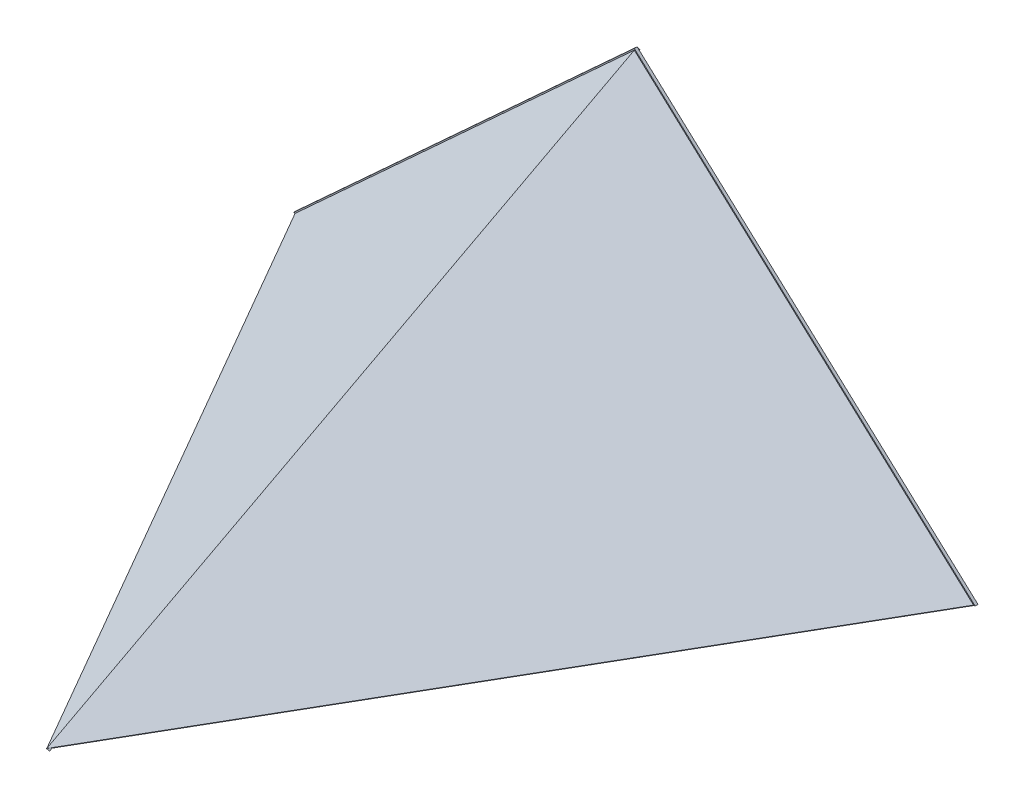
ISO-10303-21;
HEADER;
FILE_DESCRIPTION(('STEP AP214'),'2;1');
FILE_NAME('part.step','',(''),(''),'','','');
FILE_SCHEMA(('AUTOMOTIVE_DESIGN { 1 0 10303 214 1 1 1 1 }'));
ENDSEC;
DATA;
#1=APPLICATION_CONTEXT('core data for automotive mechanical design processes');
#2=APPLICATION_PROTOCOL_DEFINITION('international standard','automotive_design',2000,#1);
#3=PRODUCT_CONTEXT('',#1,'mechanical');
#4=PRODUCT('Part','Part','',(#3));
#5=PRODUCT_RELATED_PRODUCT_CATEGORY('part','',(#4));
#6=PRODUCT_DEFINITION_FORMATION('','',#4);
#7=PRODUCT_DEFINITION_CONTEXT('part definition',#1,'design');
#8=PRODUCT_DEFINITION('design','',#6,#7);
#9=PRODUCT_DEFINITION_SHAPE('','',#8);
#10=(LENGTH_UNIT() NAMED_UNIT(*) SI_UNIT(.MILLI.,.METRE.));
#11=(NAMED_UNIT(*) PLANE_ANGLE_UNIT() SI_UNIT($,.RADIAN.));
#12=(NAMED_UNIT(*) SI_UNIT($,.STERADIAN.) SOLID_ANGLE_UNIT());
#13=UNCERTAINTY_MEASURE_WITH_UNIT(LENGTH_MEASURE(1.E-05),#10,'distance_accuracy_value','');
#14=(GEOMETRIC_REPRESENTATION_CONTEXT(3) GLOBAL_UNCERTAINTY_ASSIGNED_CONTEXT((#13)) GLOBAL_UNIT_ASSIGNED_CONTEXT((#10,
#11,#12)) REPRESENTATION_CONTEXT('',''));
#15=CARTESIAN_POINT('',(0.,0.,0.));
#16=DIRECTION('',(0.,0.,1.));
#17=DIRECTION('',(1.,0.,0.));
#18=AXIS2_PLACEMENT_3D('',#15,#16,#17);
#19=CARTESIAN_POINT('',(-119.189680055577,130.025105515175,68.8141938647123));
#20=DIRECTION('',(0.629514264816126,-0.686742834344865,-0.363450230250298));
#21=DIRECTION('',(0.737154140200741,0.675724628517346,0.));
#22=AXIS2_PLACEMENT_3D('',#19,#20,#21);
#23=PLANE('',#22);
#24=DIRECTION('',(0.499999999999998,0.,0.86602540378444));
#25=VECTOR('',#24,1.);
#26=CARTESIAN_POINT('',(-225.573857295266,0.,130.235127231563));
#27=LINE('',#26,#25);
#28=CARTESIAN_POINT('',(-300.765143060354,0.,0.));
#29=VERTEX_POINT('',#28);
#30=CARTESIAN_POINT('',(-299.298673376612,0.,2.54));
#31=VERTEX_POINT('',#30);
#32=EDGE_CURVE('E172',#29,#31,#27,.T.);
#33=ORIENTED_EDGE('',*,*,#32,.T.);
#34=DIRECTION('',(0.737154140200741,0.675724628517346,0.));
#35=VECTOR('',#34,1.);
#36=CARTESIAN_POINT('',(-136.660903692717,149.084622210237,2.54));
#37=LINE('',#36,#35);
#38=CARTESIAN_POINT('',(-1.11022302462516E-13,274.357117261894,2.54));
#39=VERTEX_POINT('',#38);
#40=EDGE_CURVE('E175',#31,#39,#37,.T.);
#41=ORIENTED_EDGE('',*,*,#40,.T.);
#42=DIRECTION('',(0.,0.467767581118816,-0.883851509052426));
#43=VECTOR('',#42,1.);
#44=CARTESIAN_POINT('',(0.,215.376124144485,113.985174647516));
#45=LINE('',#44,#43);
#46=CARTESIAN_POINT('',(0.,-1.74432679923594,524.236431807654));
#47=VERTEX_POINT('',#46);
#48=EDGE_CURVE('E259',#47,#39,#45,.T.);
#49=ORIENTED_EDGE('',*,*,#48,.F.);
#50=DIRECTION('',(-0.499999999999998,0.,-0.86602540378444));
#51=VECTOR('',#50,1.);
#52=CARTESIAN_POINT('',(-303.201033767367,-1.74432679923598,-0.92316358483577));
#53=LINE('',#52,#51);
#54=CARTESIAN_POINT('',(-303.201033767367,-1.74432679923598,-0.92316358483577));
#55=VERTEX_POINT('',#54);
#56=EDGE_CURVE('E190',#47,#55,#53,.T.);
#57=ORIENTED_EDGE('',*,*,#56,.T.);
#58=DIRECTION('',(0.737154140200741,0.675724628517346,0.));
#59=VECTOR('',#58,1.);
#60=CARTESIAN_POINT('',(1.59896623263293,277.655673200764,-0.923163584835839));
#61=LINE('',#60,#59);
#62=CARTESIAN_POINT('',(0.,276.189954154184,-0.923163584835817));
#63=VERTEX_POINT('',#62);
#64=EDGE_CURVE('E183',#55,#63,#61,.T.);
#65=ORIENTED_EDGE('',*,*,#64,.T.);
#66=CARTESIAN_POINT('',(0.,275.701381138657,0.));
#67=VERTEX_POINT('',#66);
#68=EDGE_CURVE('E258',#67,#63,#45,.T.);
#69=ORIENTED_EDGE('',*,*,#68,.F.);
#70=DIRECTION('',(0.737154140200741,0.675724628517346,0.));
#71=VECTOR('',#70,1.);
#72=CARTESIAN_POINT('',(-137.330499284161,149.815090128176,0.));
#73=LINE('',#72,#71);
#74=EDGE_CURVE('E47',#29,#67,#73,.T.);
#75=ORIENTED_EDGE('',*,*,#74,.F.);
#76=EDGE_LOOP('',(#33,#41,#49,#57,#65,#69,#75));
#77=FACE_BOUND('',#76,.T.);
#78=ADVANCED_FACE('F32',(#77),#23,.T.);
#79=CARTESIAN_POINT('',(-120.78864628821,131.769432314411,69.7373574495481));
#80=DIRECTION('',(0.629514264816126,-0.686742834344865,-0.363450230250298));
#81=DIRECTION('',(0.737154140200741,0.675724628517346,0.));
#82=AXIS2_PLACEMENT_3D('',#79,#80,#81);
#83=PLANE('',#82);
#84=DIRECTION('',(0.737154140200741,0.675724628517346,0.));
#85=VECTOR('',#84,1.);
#86=CARTESIAN_POINT('',(-138.503234597235,151.094437742438,2.54));
#87=LINE('',#86,#85);
#88=CARTESIAN_POINT('',(-303.333530316258,0.,2.54));
#89=VERTEX_POINT('',#88);
#90=CARTESIAN_POINT('',(0.,278.055736123237,2.54));
#91=VERTEX_POINT('',#90);
#92=EDGE_CURVE('E181',#89,#91,#87,.T.);
#93=ORIENTED_EDGE('',*,*,#92,.F.);
#94=DIRECTION('',(-0.499999999999998,0.,-0.86602540378444));
#95=VECTOR('',#94,1.);
#96=CARTESIAN_POINT('',(-304.8,0.,0.));
#97=LINE('',#96,#95);
#98=CARTESIAN_POINT('',(0.,0.,527.929086146997));
#99=VERTEX_POINT('',#98);
#100=EDGE_CURVE('E195',#99,#89,#97,.T.);
#101=ORIENTED_EDGE('',*,*,#100,.F.);
#102=DIRECTION('',(0.,0.467767581118816,-0.883851509052426));
#103=VECTOR('',#102,1.);
#104=CARTESIAN_POINT('',(0.,0.,527.929086146997));
#105=LINE('',#104,#103);
#106=EDGE_CURVE('E247',#99,#91,#105,.T.);
#107=ORIENTED_EDGE('',*,*,#106,.T.);
#108=EDGE_LOOP('',(#93,#101,#107));
#109=FACE_BOUND('',#108,.T.);
#110=ADVANCED_FACE('F316',(#109),#83,.F.);
#111=CARTESIAN_POINT('',(120.78864628821,131.769432314411,69.737357449548));
#112=DIRECTION('',(0.629514264816126,0.686742834344865,0.363450230250298));
#113=DIRECTION('',(-0.737154140200742,0.675724628517346,0.));
#114=AXIS2_PLACEMENT_3D('',#111,#112,#113);
#115=PLANE('',#114);
#116=DIRECTION('',(-0.499999999999998,0.,0.86602540378444));
#117=VECTOR('',#116,1.);
#118=CARTESIAN_POINT('',(304.8,0.,0.));
#119=LINE('',#118,#117);
#120=CARTESIAN_POINT('',(303.333530316258,0.,2.54));
#121=VERTEX_POINT('',#120);
#122=EDGE_CURVE('E243',#121,#99,#119,.T.);
#123=ORIENTED_EDGE('',*,*,#122,.F.);
#124=DIRECTION('',(-0.737154140200742,0.675724628517346,0.));
#125=VECTOR('',#124,1.);
#126=CARTESIAN_POINT('',(138.503234597235,151.094437742438,2.54));
#127=LINE('',#126,#125);
#128=EDGE_CURVE('E178',#121,#91,#127,.T.);
#129=ORIENTED_EDGE('',*,*,#128,.T.);
#130=ORIENTED_EDGE('',*,*,#106,.F.);
#131=EDGE_LOOP('',(#123,#129,#130));
#132=FACE_BOUND('',#131,.T.);
#133=ADVANCED_FACE('F321',(#132),#115,.T.);
#134=CARTESIAN_POINT('',(119.189680055577,130.025105515175,68.8141938647123));
#135=DIRECTION('',(0.629514264816126,0.686742834344865,0.363450230250298));
#136=DIRECTION('',(-0.737154140200742,0.675724628517346,0.));
#137=AXIS2_PLACEMENT_3D('',#134,#135,#136);
#138=PLANE('',#137);
#139=DIRECTION('',(-0.737154140200742,0.675724628517346,0.));
#140=VECTOR('',#139,1.);
#141=CARTESIAN_POINT('',(136.660903692717,149.084622210237,2.54));
#142=LINE('',#141,#140);
#143=CARTESIAN_POINT('',(299.298673376612,0.,2.54));
#144=VERTEX_POINT('',#143);
#145=EDGE_CURVE('E11',#144,#39,#142,.T.);
#146=ORIENTED_EDGE('',*,*,#145,.F.);
#147=DIRECTION('',(-0.499999999999998,0.,0.86602540378444));
#148=VECTOR('',#147,1.);
#149=CARTESIAN_POINT('',(225.573857295266,0.,130.235127231563));
#150=LINE('',#149,#148);
#151=CARTESIAN_POINT('',(300.765143060353,0.,0.));
#152=VERTEX_POINT('',#151);
#153=EDGE_CURVE('E169',#152,#144,#150,.T.);
#154=ORIENTED_EDGE('',*,*,#153,.F.);
#155=DIRECTION('',(-0.737154140200742,0.675724628517346,0.));
#156=VECTOR('',#155,1.);
#157=CARTESIAN_POINT('',(137.330499284161,149.815090128176,0.));
#158=LINE('',#157,#156);
#159=EDGE_CURVE('E160',#152,#67,#158,.T.);
#160=ORIENTED_EDGE('',*,*,#159,.T.);
#161=ORIENTED_EDGE('',*,*,#68,.T.);
#162=DIRECTION('',(0.737154140200742,-0.675724628517346,0.));
#163=VECTOR('',#162,1.);
#164=CARTESIAN_POINT('',(-1.59896623263302,277.655673200764,-0.923163584835784));
#165=LINE('',#164,#163);
#166=CARTESIAN_POINT('',(303.201033767367,-1.74432679923598,-0.92316358483577));
#167=VERTEX_POINT('',#166);
#168=EDGE_CURVE('E232',#63,#167,#165,.T.);
#169=ORIENTED_EDGE('',*,*,#168,.T.);
#170=DIRECTION('',(-0.499999999999998,0.,0.86602540378444));
#171=VECTOR('',#170,1.);
#172=CARTESIAN_POINT('',(303.201033767367,-1.74432679923598,-0.92316358483577));
#173=LINE('',#172,#171);
#174=EDGE_CURVE('E233',#167,#47,#173,.T.);
#175=ORIENTED_EDGE('',*,*,#174,.T.);
#176=ORIENTED_EDGE('',*,*,#48,.T.);
#177=EDGE_LOOP('',(#146,#154,#160,#161,#169,#175,#176));
#178=FACE_BOUND('',#177,.T.);
#179=ADVANCED_FACE('F299',(#178),#138,.F.);
#180=CARTESIAN_POINT('',(-1.59896623263302,277.655673200764,-0.923163584835784));
#181=DIRECTION('',(-0.245592271820426,-0.26791884198592,0.931613616329756));
#182=DIRECTION('',(0.,-0.96104740559029,-0.276383581654504));
#183=AXIS2_PLACEMENT_3D('',#180,#181,#182);
#184=PLANE('',#183);
#185=DIRECTION('',(0.,0.96104740559029,0.276383581654504));
#186=VECTOR('',#185,1.);
#187=CARTESIAN_POINT('',(-1.76074432811646E-13,277.543710023952,-0.533842627517825));
#188=LINE('',#187,#186);
#189=CARTESIAN_POINT('',(0.,279.4,0.));
#190=VERTEX_POINT('',#189);
#191=EDGE_CURVE('E224',#63,#190,#188,.T.);
#192=ORIENTED_EDGE('',*,*,#191,.F.);
#193=CARTESIAN_POINT('',(-1.59896623263302,277.655673200764,-0.923163584835784));
#194=VERTEX_POINT('',#193);
#195=EDGE_CURVE('E228',#194,#63,#165,.T.);
#196=ORIENTED_EDGE('',*,*,#195,.F.);
#197=DIRECTION('',(0.629514264816126,0.686742834344865,0.363450230250298));
#198=VECTOR('',#197,1.);
#199=CARTESIAN_POINT('',(-1.59896623263302,277.655673200764,-0.923163584835784));
#200=LINE('',#199,#198);
#201=EDGE_CURVE('E240',#194,#190,#200,.T.);
#202=ORIENTED_EDGE('',*,*,#201,.T.);
#203=EDGE_LOOP('',(#192,#196,#202));
#204=FACE_BOUND('',#203,.T.);
#205=ADVANCED_FACE('F34',(#204),#184,.F.);
#206=CARTESIAN_POINT('',(-1.598966232633,-1.74432679923598,527.005922562161));
#207=DIRECTION('',(0.776988925527908,-0.556397132927762,-0.294466364932829));
#208=DIRECTION('',(0.582211308809713,0.813037509524672,0.));
#209=AXIS2_PLACEMENT_3D('',#206,#207,#208);
#210=PLANE('',#209);
#211=DIRECTION('',(-0.59852800149454,-0.797888831951326,-0.0716773553802132));
#212=VECTOR('',#211,1.);
#213=CARTESIAN_POINT('',(-112.226725847639,129.792210595495,-13.4398305370051));
#214=LINE('',#213,#212);
#215=CARTESIAN_POINT('',(-1.59896623263297,277.268441749593,-0.191485896418014));
#216=VERTEX_POINT('',#215);
#217=EDGE_CURVE('E221',#190,#216,#214,.T.);
#218=ORIENTED_EDGE('',*,*,#217,.F.);
#219=ORIENTED_EDGE('',*,*,#201,.F.);
#220=DIRECTION('',(0.,0.467767581118816,-0.883851509052426));
#221=VECTOR('',#220,1.);
#222=CARTESIAN_POINT('',(-1.598966232633,-1.74432679923598,527.005922562161));
#223=LINE('',#222,#221);
#224=EDGE_CURVE('E236',#216,#194,#223,.T.);
#225=ORIENTED_EDGE('',*,*,#224,.F.);
#226=EDGE_LOOP('',(#218,#219,#225));
#227=FACE_BOUND('',#226,.T.);
#228=ADVANCED_FACE('F373',(#227),#210,.F.);
#229=DIRECTION('',(0.775140245537367,-0.522824761682502,-0.354699687510301));
#230=VECTOR('',#229,1.);
#231=CARTESIAN_POINT('',(111.675618756737,200.865805913422,-52.0252800129069));
#232=LINE('',#231,#230);
#233=EDGE_CURVE('E40',#216,#63,#232,.T.);
#234=ORIENTED_EDGE('',*,*,#233,.F.);
#235=ORIENTED_EDGE('',*,*,#224,.T.);
#236=ORIENTED_EDGE('',*,*,#195,.T.);
#237=EDGE_LOOP('',(#234,#235,#236));
#238=FACE_BOUND('',#237,.T.);
#239=ADVANCED_FACE('F292',(#238),#138,.F.);
#240=CARTESIAN_POINT('',(-303.201033767367,-1.74432679923598,-0.92316358483577));
#241=DIRECTION('',(0.594736740409582,0.726900460500598,-0.343371417172431));
#242=DIRECTION('',(-0.77395729920332,0.633237790257264,0.));
#243=AXIS2_PLACEMENT_3D('',#240,#241,#242);
#244=PLANE('',#243);
#245=DIRECTION('',(-0.754367725884672,0.652248077402468,0.074173982422233));
#246=VECTOR('',#245,1.);
#247=CARTESIAN_POINT('',(28.4750959758963,-26.364715459618,521.436588712682));
#248=LINE('',#247,#246);
#249=CARTESIAN_POINT('',(-1.59896623263297,-0.361814510758644,524.393651806818));
#250=VERTEX_POINT('',#249);
#251=EDGE_CURVE('E262',#47,#250,#248,.T.);
#252=ORIENTED_EDGE('',*,*,#251,.T.);
#253=DIRECTION('',(0.410303048621057,0.0928434846026204,0.907210833080773));
#254=VECTOR('',#253,1.);
#255=CARTESIAN_POINT('',(-0.679262483531787,-0.153703698139454,526.427185818358));
#256=LINE('',#255,#254);
#257=EDGE_CURVE('E217',#250,#99,#256,.T.);
#258=ORIENTED_EDGE('',*,*,#257,.T.);
#259=ORIENTED_EDGE('',*,*,#100,.T.);
#260=DIRECTION('',(0.499999999999998,0.,0.86602540378444));
#261=VECTOR('',#260,1.);
#262=CARTESIAN_POINT('',(-304.8,0.,0.));
#263=LINE('',#262,#261);
#264=CARTESIAN_POINT('',(-304.8,0.,0.));
#265=VERTEX_POINT('',#264);
#266=EDGE_CURVE('E141',#265,#89,#263,.T.);
#267=ORIENTED_EDGE('',*,*,#266,.F.);
#268=DIRECTION('',(-0.629514264816126,0.686742834344864,0.363450230250298));
#269=VECTOR('',#268,1.);
#270=CARTESIAN_POINT('',(-303.201033767367,-1.74432679923598,-0.92316358483577));
#271=LINE('',#270,#269);
#272=EDGE_CURVE('E193',#55,#265,#271,.T.);
#273=ORIENTED_EDGE('',*,*,#272,.F.);
#274=ORIENTED_EDGE('',*,*,#56,.F.);
#275=EDGE_LOOP('',(#252,#258,#259,#267,#273,#274));
#276=FACE_BOUND('',#275,.T.);
#277=ADVANCED_FACE('F277',(#276),#244,.F.);
#278=CARTESIAN_POINT('',(1.59896623263293,277.655673200764,-0.923163584835839));
#279=DIRECTION('',(0.245592271820427,-0.26791884198592,0.931613616329756));
#280=DIRECTION('',(0.,-0.96104740559029,-0.276383581654504));
#281=AXIS2_PLACEMENT_3D('',#278,#279,#280);
#282=PLANE('',#281);
#283=DIRECTION('',(0.737154140200741,0.675724628517346,0.));
#284=VECTOR('',#283,1.);
#285=CARTESIAN_POINT('',(0.,279.4,0.));
#286=LINE('',#285,#284);
#287=EDGE_CURVE('E159',#265,#190,#286,.T.);
#288=ORIENTED_EDGE('',*,*,#287,.T.);
#289=ORIENTED_EDGE('',*,*,#217,.T.);
#290=ORIENTED_EDGE('',*,*,#233,.T.);
#291=ORIENTED_EDGE('',*,*,#64,.F.);
#292=ORIENTED_EDGE('',*,*,#272,.T.);
#293=EDGE_LOOP('',(#288,#289,#290,#291,#292));
#294=FACE_BOUND('',#293,.T.);
#295=ADVANCED_FACE('F267',(#294),#282,.F.);
#296=CARTESIAN_POINT('',(303.201033767367,-1.74432679923598,-0.92316358483577));
#297=DIRECTION('',(-0.594736740409582,0.726900460500598,-0.343371417172431));
#298=DIRECTION('',(-0.77395729920332,-0.633237790257264,0.));
#299=AXIS2_PLACEMENT_3D('',#296,#297,#298);
#300=PLANE('',#299);
#301=DIRECTION('',(-0.410303048621057,0.0928434846026206,0.907210833080773));
#302=VECTOR('',#301,1.);
#303=CARTESIAN_POINT('',(247.965313101537,-56.1096579864533,-20.3408305158542));
#304=LINE('',#303,#302);
#305=CARTESIAN_POINT('',(1.59896623263288,-0.361814510758594,524.393651806818));
#306=VERTEX_POINT('',#305);
#307=EDGE_CURVE('E205',#306,#99,#304,.T.);
#308=ORIENTED_EDGE('',*,*,#307,.F.);
#309=DIRECTION('',(-0.754367725884671,-0.652248077402468,-0.0741739824222333));
#310=VECTOR('',#309,1.);
#311=CARTESIAN_POINT('',(143.157793419765,122.034027336631,538.312569065873));
#312=LINE('',#311,#310);
#313=EDGE_CURVE('E211',#306,#47,#312,.T.);
#314=ORIENTED_EDGE('',*,*,#313,.T.);
#315=ORIENTED_EDGE('',*,*,#174,.F.);
#316=DIRECTION('',(0.629514264816126,0.686742834344865,0.363450230250298));
#317=VECTOR('',#316,1.);
#318=CARTESIAN_POINT('',(303.201033767367,-1.74432679923598,-0.92316358483577));
#319=LINE('',#318,#317);
#320=CARTESIAN_POINT('',(304.8,0.,0.));
#321=VERTEX_POINT('',#320);
#322=EDGE_CURVE('E255',#167,#321,#319,.T.);
#323=ORIENTED_EDGE('',*,*,#322,.T.);
#324=EDGE_CURVE('E244',#321,#121,#119,.T.);
#325=ORIENTED_EDGE('',*,*,#324,.T.);
#326=ORIENTED_EDGE('',*,*,#122,.T.);
#327=EDGE_LOOP('',(#308,#314,#315,#323,#325,#326));
#328=FACE_BOUND('',#327,.T.);
#329=ADVANCED_FACE('F302',(#328),#300,.F.);
#330=DIRECTION('',(0.59852800149454,-0.797888831951326,-0.0716773553802134));
#331=VECTOR('',#330,1.);
#332=CARTESIAN_POINT('',(0.299816282317385,279.000319345626,-0.0359048167550939));
#333=LINE('',#332,#331);
#334=CARTESIAN_POINT('',(1.59896623263293,277.268441749593,-0.191485896417881));
#335=VERTEX_POINT('',#334);
#336=EDGE_CURVE('E208',#190,#335,#333,.T.);
#337=ORIENTED_EDGE('',*,*,#336,.F.);
#338=DIRECTION('',(0.737154140200742,-0.675724628517346,0.));
#339=VECTOR('',#338,1.);
#340=CARTESIAN_POINT('',(0.,279.4,0.));
#341=LINE('',#340,#339);
#342=EDGE_CURVE('E227',#190,#321,#341,.T.);
#343=ORIENTED_EDGE('',*,*,#342,.T.);
#344=ORIENTED_EDGE('',*,*,#322,.F.);
#345=ORIENTED_EDGE('',*,*,#168,.F.);
#346=DIRECTION('',(0.775140245537367,0.522824761682502,0.354699687510301));
#347=VECTOR('',#346,1.);
#348=CARTESIAN_POINT('',(-0.366725723291517,275.942601123572,-1.09097515210033));
#349=LINE('',#348,#347);
#350=EDGE_CURVE('E214',#63,#335,#349,.T.);
#351=ORIENTED_EDGE('',*,*,#350,.T.);
#352=EDGE_LOOP('',(#337,#343,#344,#345,#351));
#353=FACE_BOUND('',#352,.T.);
#354=ADVANCED_FACE('F295',(#353),#184,.F.);
#355=ORIENTED_EDGE('',*,*,#251,.F.);
#356=CARTESIAN_POINT('',(-1.598966232633,-1.74432679923598,527.005922562161));
#357=VERTEX_POINT('',#356);
#358=EDGE_CURVE('E231',#47,#357,#173,.T.);
#359=ORIENTED_EDGE('',*,*,#358,.T.);
#360=EDGE_CURVE('E237',#357,#250,#223,.T.);
#361=ORIENTED_EDGE('',*,*,#360,.T.);
#362=EDGE_LOOP('',(#355,#359,#361));
#363=FACE_BOUND('',#362,.T.);
#364=ADVANCED_FACE('F312',(#363),#138,.F.);
#365=ORIENTED_EDGE('',*,*,#257,.F.);
#366=ORIENTED_EDGE('',*,*,#360,.F.);
#367=DIRECTION('',(0.629514264816126,0.686742834344865,0.363450230250298));
#368=VECTOR('',#367,1.);
#369=CARTESIAN_POINT('',(-1.598966232633,-1.74432679923598,527.005922562161));
#370=LINE('',#369,#368);
#371=EDGE_CURVE('E252',#357,#99,#370,.T.);
#372=ORIENTED_EDGE('',*,*,#371,.T.);
#373=EDGE_LOOP('',(#365,#366,#372));
#374=FACE_BOUND('',#373,.T.);
#375=ADVANCED_FACE('F436',(#374),#210,.F.);
#376=DIRECTION('',(0.,-0.427121098088624,-0.904194430179465));
#377=VECTOR('',#376,1.);
#378=CARTESIAN_POINT('',(0.,-204.561234522003,94.8829788178476));
#379=LINE('',#378,#377);
#380=EDGE_CURVE('E55',#99,#47,#379,.T.);
#381=ORIENTED_EDGE('',*,*,#380,.F.);
#382=ORIENTED_EDGE('',*,*,#371,.F.);
#383=ORIENTED_EDGE('',*,*,#358,.F.);
#384=EDGE_LOOP('',(#381,#382,#383));
#385=FACE_BOUND('',#384,.T.);
#386=ADVANCED_FACE('F309',(#385),#300,.F.);
#387=ORIENTED_EDGE('',*,*,#313,.F.);
#388=DIRECTION('',(0.,-0.467767581118817,0.883851509052426));
#389=VECTOR('',#388,1.);
#390=CARTESIAN_POINT('',(1.59896623263292,-1.74432679923601,527.005922562161));
#391=LINE('',#390,#389);
#392=CARTESIAN_POINT('',(1.59896623263292,-1.74432679923601,527.005922562161));
#393=VERTEX_POINT('',#392);
#394=EDGE_CURVE('E186',#306,#393,#391,.T.);
#395=ORIENTED_EDGE('',*,*,#394,.T.);
#396=EDGE_CURVE('E191',#393,#47,#53,.T.);
#397=ORIENTED_EDGE('',*,*,#396,.T.);
#398=EDGE_LOOP('',(#387,#395,#397));
#399=FACE_BOUND('',#398,.T.);
#400=ADVANCED_FACE('F346',(#399),#23,.T.);
#401=DIRECTION('',(-0.629514264816126,0.686742834344864,0.363450230250298));
#402=VECTOR('',#401,1.);
#403=CARTESIAN_POINT('',(1.59896623263292,-1.74432679923601,527.005922562161));
#404=LINE('',#403,#402);
#405=EDGE_CURVE('E200',#393,#99,#404,.T.);
#406=ORIENTED_EDGE('',*,*,#405,.T.);
#407=ORIENTED_EDGE('',*,*,#380,.T.);
#408=ORIENTED_EDGE('',*,*,#396,.F.);
#409=EDGE_LOOP('',(#406,#407,#408));
#410=FACE_BOUND('',#409,.T.);
#411=ADVANCED_FACE('F352',(#410),#244,.F.);
#412=CARTESIAN_POINT('',(1.59896623263292,-1.74432679923601,527.005922562161));
#413=DIRECTION('',(-0.776988925527908,-0.556397132927762,-0.294466364932829));
#414=DIRECTION('',(0.582211308809713,-0.813037509524672,0.));
#415=AXIS2_PLACEMENT_3D('',#412,#413,#414);
#416=PLANE('',#415);
#417=ORIENTED_EDGE('',*,*,#394,.F.);
#418=ORIENTED_EDGE('',*,*,#307,.T.);
#419=ORIENTED_EDGE('',*,*,#405,.F.);
#420=EDGE_LOOP('',(#417,#418,#419));
#421=FACE_BOUND('',#420,.T.);
#422=ADVANCED_FACE('F341',(#421),#416,.F.);
#423=CARTESIAN_POINT('',(1.59896623263293,277.655673200764,-0.923163584835839));
#424=VERTEX_POINT('',#423);
#425=EDGE_CURVE('E187',#63,#424,#61,.T.);
#426=ORIENTED_EDGE('',*,*,#425,.F.);
#427=ORIENTED_EDGE('',*,*,#191,.T.);
#428=DIRECTION('',(-0.629514264816126,0.686742834344864,0.363450230250298));
#429=VECTOR('',#428,1.);
#430=CARTESIAN_POINT('',(1.59896623263293,277.655673200764,-0.923163584835839));
#431=LINE('',#430,#429);
#432=EDGE_CURVE('E202',#424,#190,#431,.T.);
#433=ORIENTED_EDGE('',*,*,#432,.F.);
#434=EDGE_LOOP('',(#426,#427,#433));
#435=FACE_BOUND('',#434,.T.);
#436=ADVANCED_FACE('F286',(#435),#282,.F.);
#437=ORIENTED_EDGE('',*,*,#350,.F.);
#438=ORIENTED_EDGE('',*,*,#425,.T.);
#439=EDGE_CURVE('E188',#424,#335,#391,.T.);
#440=ORIENTED_EDGE('',*,*,#439,.T.);
#441=EDGE_LOOP('',(#437,#438,#440));
#442=FACE_BOUND('',#441,.T.);
#443=ADVANCED_FACE('F339',(#442),#23,.T.);
#444=ORIENTED_EDGE('',*,*,#432,.T.);
#445=ORIENTED_EDGE('',*,*,#336,.T.);
#446=ORIENTED_EDGE('',*,*,#439,.F.);
#447=EDGE_LOOP('',(#444,#445,#446));
#448=FACE_BOUND('',#447,.T.);
#449=ADVANCED_FACE('F281',(#448),#416,.F.);
#450=CARTESIAN_POINT('',(0.,279.4,2.54));
#451=DIRECTION('',(-0.675724628517346,-0.737154140200741,0.));
#452=DIRECTION('',(0.737154140200742,-0.675724628517346,0.));
#453=AXIS2_PLACEMENT_3D('',#450,#451,#452);
#454=PLANE('',#453);
#455=ORIENTED_EDGE('',*,*,#342,.F.);
#456=DIRECTION('',(0.,0.,-1.));
#457=VECTOR('',#456,1.);
#458=CARTESIAN_POINT('',(0.,279.4,2.54));
#459=LINE('',#458,#457);
#460=CARTESIAN_POINT('',(0.,279.4,2.54));
#461=VERTEX_POINT('',#460);
#462=EDGE_CURVE('E164',#461,#190,#459,.T.);
#463=ORIENTED_EDGE('',*,*,#462,.F.);
#464=DIRECTION('',(-0.737154140200741,0.675724628517346,0.));
#465=VECTOR('',#464,1.);
#466=CARTESIAN_POINT('',(0.,279.4,2.54));
#467=LINE('',#466,#465);
#468=CARTESIAN_POINT('',(304.8,0.,2.54));
#469=VERTEX_POINT('',#468);
#470=EDGE_CURVE('E144',#469,#461,#467,.T.);
#471=ORIENTED_EDGE('',*,*,#470,.F.);
#472=DIRECTION('',(0.,0.,-1.));
#473=VECTOR('',#472,1.);
#474=CARTESIAN_POINT('',(304.8,0.,2.54));
#475=LINE('',#474,#473);
#476=EDGE_CURVE('E161',#469,#321,#475,.T.);
#477=ORIENTED_EDGE('',*,*,#476,.T.);
#478=EDGE_LOOP('',(#455,#463,#471,#477));
#479=FACE_BOUND('',#478,.T.);
#480=ADVANCED_FACE('F331',(#479),#454,.F.);
#481=CARTESIAN_POINT('',(-304.8,0.,2.54));
#482=DIRECTION('',(0.675724628517346,-0.737154140200741,0.));
#483=DIRECTION('',(0.737154140200741,0.675724628517346,0.));
#484=AXIS2_PLACEMENT_3D('',#481,#482,#483);
#485=PLANE('',#484);
#486=ORIENTED_EDGE('',*,*,#287,.F.);
#487=DIRECTION('',(0.,0.,-1.));
#488=VECTOR('',#487,1.);
#489=CARTESIAN_POINT('',(-304.8,0.,2.54));
#490=LINE('',#489,#488);
#491=CARTESIAN_POINT('',(-304.8,0.,2.54));
#492=VERTEX_POINT('',#491);
#493=EDGE_CURVE('E138',#492,#265,#490,.T.);
#494=ORIENTED_EDGE('',*,*,#493,.F.);
#495=DIRECTION('',(-0.737154140200741,-0.675724628517346,0.));
#496=VECTOR('',#495,1.);
#497=CARTESIAN_POINT('',(-304.8,0.,2.54));
#498=LINE('',#497,#496);
#499=EDGE_CURVE('E149',#461,#492,#498,.T.);
#500=ORIENTED_EDGE('',*,*,#499,.F.);
#501=ORIENTED_EDGE('',*,*,#462,.T.);
#502=EDGE_LOOP('',(#486,#494,#500,#501));
#503=FACE_BOUND('',#502,.T.);
#504=ADVANCED_FACE('F157',(#503),#485,.F.);
#505=CARTESIAN_POINT('',(304.8,0.,2.54));
#506=DIRECTION('',(0.,1.,0.));
#507=DIRECTION('',(-1.,0.,0.));
#508=AXIS2_PLACEMENT_3D('',#505,#506,#507);
#509=PLANE('',#508);
#510=DIRECTION('',(1.,0.,0.));
#511=VECTOR('',#510,1.);
#512=CARTESIAN_POINT('',(304.8,0.,2.54));
#513=LINE('',#512,#511);
#514=EDGE_CURVE('E147',#121,#469,#513,.T.);
#515=ORIENTED_EDGE('',*,*,#514,.F.);
#516=ORIENTED_EDGE('',*,*,#324,.F.);
#517=ORIENTED_EDGE('',*,*,#476,.F.);
#518=EDGE_LOOP('',(#515,#516,#517));
#519=FACE_BOUND('',#518,.T.);
#520=ADVANCED_FACE('F325',(#519),#509,.F.);
#521=ORIENTED_EDGE('',*,*,#493,.T.);
#522=ORIENTED_EDGE('',*,*,#266,.T.);
#523=EDGE_CURVE('E134',#492,#89,#513,.T.);
#524=ORIENTED_EDGE('',*,*,#523,.F.);
#525=EDGE_LOOP('',(#521,#522,#524));
#526=FACE_BOUND('',#525,.T.);
#527=ADVANCED_FACE('F136',(#526),#509,.F.);
#528=CARTESIAN_POINT('',(0.,0.,2.54));
#529=DIRECTION('',(0.,0.,-1.));
#530=DIRECTION('',(-1.,0.,0.));
#531=AXIS2_PLACEMENT_3D('',#528,#529,#530);
#532=PLANE('',#531);
#533=ORIENTED_EDGE('',*,*,#523,.T.);
#534=ORIENTED_EDGE('',*,*,#92,.T.);
#535=ORIENTED_EDGE('',*,*,#128,.F.);
#536=ORIENTED_EDGE('',*,*,#514,.T.);
#537=ORIENTED_EDGE('',*,*,#470,.T.);
#538=ORIENTED_EDGE('',*,*,#499,.T.);
#539=EDGE_LOOP('',(#533,#534,#535,#536,#537,#538));
#540=FACE_BOUND('',#539,.T.);
#541=ADVANCED_FACE('F150',(#540),#532,.F.);
#542=ORIENTED_EDGE('',*,*,#32,.F.);
#543=DIRECTION('',(1.,0.,0.));
#544=VECTOR('',#543,1.);
#545=CARTESIAN_POINT('',(304.8,0.,0.));
#546=LINE('',#545,#544);
#547=EDGE_CURVE('E155',#29,#152,#546,.T.);
#548=ORIENTED_EDGE('',*,*,#547,.T.);
#549=ORIENTED_EDGE('',*,*,#153,.T.);
#550=EDGE_CURVE('E145',#31,#144,#513,.T.);
#551=ORIENTED_EDGE('',*,*,#550,.F.);
#552=EDGE_LOOP('',(#542,#548,#549,#551));
#553=FACE_BOUND('',#552,.T.);
#554=ADVANCED_FACE('F485',(#553),#509,.F.);
#555=ORIENTED_EDGE('',*,*,#40,.F.);
#556=ORIENTED_EDGE('',*,*,#550,.T.);
#557=ORIENTED_EDGE('',*,*,#145,.T.);
#558=EDGE_LOOP('',(#555,#556,#557));
#559=FACE_BOUND('',#558,.T.);
#560=ADVANCED_FACE('F501',(#559),#532,.F.);
#561=CARTESIAN_POINT('',(0.,0.,0.));
#562=DIRECTION('',(0.,0.,-1.));
#563=DIRECTION('',(-1.,0.,0.));
#564=AXIS2_PLACEMENT_3D('',#561,#562,#563);
#565=PLANE('',#564);
#566=ORIENTED_EDGE('',*,*,#547,.F.);
#567=ORIENTED_EDGE('',*,*,#74,.T.);
#568=ORIENTED_EDGE('',*,*,#159,.F.);
#569=EDGE_LOOP('',(#566,#567,#568));
#570=FACE_BOUND('',#569,.T.);
#571=ADVANCED_FACE('F517',(#570),#565,.T.);
#572=CLOSED_SHELL('',(#78,#110,#133,#179,#205,#228,#239,#277,#295,#329,#354,#364,#375,#386,#400,
#411,#422,#436,#443,#449,#480,#504,#520,#527,#541,#554,#560,#571));
#573=MANIFOLD_SOLID_BREP('B2',#572);
#574=ADVANCED_BREP_SHAPE_REPRESENTATION('',(#18,#573),#14);
#575=SHAPE_DEFINITION_REPRESENTATION(#9,#574);
ENDSEC;
END-ISO-10303-21;
